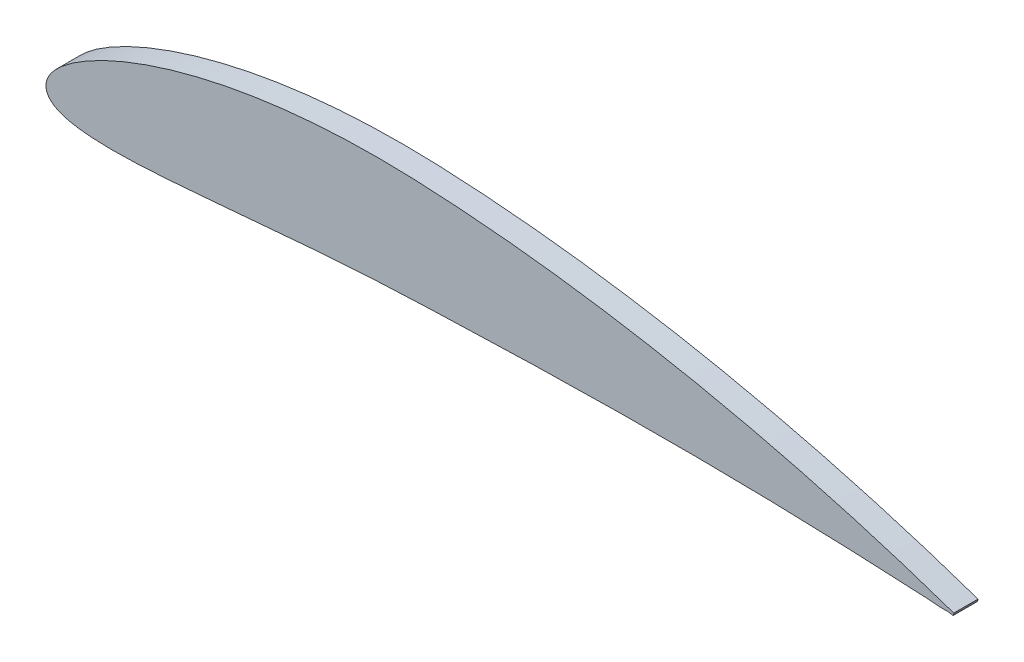
ISO-10303-21;
HEADER;
FILE_DESCRIPTION(('STEP AP214'),'2;1');
FILE_NAME('part.step','',(''),(''),'','','');
FILE_SCHEMA(('AUTOMOTIVE_DESIGN { 1 0 10303 214 1 1 1 1 }'));
ENDSEC;
DATA;
#1=APPLICATION_CONTEXT('core data for automotive mechanical design processes');
#2=APPLICATION_PROTOCOL_DEFINITION('international standard','automotive_design',2000,#1);
#3=PRODUCT_CONTEXT('',#1,'mechanical');
#4=PRODUCT('Part','Part','',(#3));
#5=PRODUCT_RELATED_PRODUCT_CATEGORY('part','',(#4));
#6=PRODUCT_DEFINITION_FORMATION('','',#4);
#7=PRODUCT_DEFINITION_CONTEXT('part definition',#1,'design');
#8=PRODUCT_DEFINITION('design','',#6,#7);
#9=PRODUCT_DEFINITION_SHAPE('','',#8);
#10=(LENGTH_UNIT() NAMED_UNIT(*) SI_UNIT(.MILLI.,.METRE.));
#11=(NAMED_UNIT(*) PLANE_ANGLE_UNIT() SI_UNIT($,.RADIAN.));
#12=(NAMED_UNIT(*) SI_UNIT($,.STERADIAN.) SOLID_ANGLE_UNIT());
#13=UNCERTAINTY_MEASURE_WITH_UNIT(LENGTH_MEASURE(1.E-05),#10,'distance_accuracy_value','');
#14=(GEOMETRIC_REPRESENTATION_CONTEXT(3) GLOBAL_UNCERTAINTY_ASSIGNED_CONTEXT((#13)) GLOBAL_UNIT_ASSIGNED_CONTEXT((#10,
#11,#12)) REPRESENTATION_CONTEXT('',''));
#15=CARTESIAN_POINT('',(0.,0.,0.));
#16=DIRECTION('',(0.,0.,1.));
#17=DIRECTION('',(1.,0.,0.));
#18=AXIS2_PLACEMENT_3D('',#15,#16,#17);
#19=CARTESIAN_POINT('',(161.929100397338,44.0446044657687,4.));
#20=CARTESIAN_POINT('',(161.795678545477,44.0905709277422,4.));
#21=CARTESIAN_POINT('',(161.264085559994,44.2737152059219,4.));
#22=CARTESIAN_POINT('',(160.074141782279,44.6843791570885,4.));
#23=CARTESIAN_POINT('',(158.100932585263,45.3469427722713,4.));
#24=CARTESIAN_POINT('',(155.365289101888,46.2489731269675,4.));
#25=CARTESIAN_POINT('',(151.890546460936,47.3534666851297,4.));
#26=CARTESIAN_POINT('',(147.709173725405,48.6259831787225,4.));
#27=CARTESIAN_POINT('',(142.862219870786,50.026640605332,4.));
#28=CARTESIAN_POINT('',(137.396269649,51.5113573455118,4.));
#29=CARTESIAN_POINT('',(131.366392873797,53.0353493280224,4.));
#30=CARTESIAN_POINT('',(124.833179772632,54.550430689247,4.));
#31=CARTESIAN_POINT('',(117.866527056055,56.0185707843522,4.));
#32=CARTESIAN_POINT('',(110.539162320194,57.3922281660989,4.));
#33=CARTESIAN_POINT('',(102.930106922823,58.630997492572,4.));
#34=CARTESIAN_POINT('',(95.1229065811543,59.7027110470993,4.));
#35=CARTESIAN_POINT('',(87.2052832633938,60.5729566099698,4.));
#36=CARTESIAN_POINT('',(79.262177626485,61.2141146853402,4.));
#37=CARTESIAN_POINT('',(71.3294619434141,61.6351664380537,4.));
#38=CARTESIAN_POINT('',(63.4919527344883,61.6847232377167,4.));
#39=CARTESIAN_POINT('',(55.8591825561266,61.3017861144408,4.));
#40=CARTESIAN_POINT('',(48.5895295329966,60.5246240796734,4.));
#41=CARTESIAN_POINT('',(41.7791614978956,59.3991089463527,4.));
#42=CARTESIAN_POINT('',(35.5177021533531,57.9743590926058,4.));
#43=CARTESIAN_POINT('',(29.8836338943388,56.3199344941267,4.));
#44=CARTESIAN_POINT('',(24.9428129391636,54.5099920343247,4.));
#45=CARTESIAN_POINT('',(20.7484042577943,52.6177610201734,4.));
#46=CARTESIAN_POINT('',(17.3401273050885,50.7161555624832,4.));
#47=CARTESIAN_POINT('',(14.7331117837232,48.8723746632682,4.));
#48=CARTESIAN_POINT('',(12.9413312663416,47.1265021049938,4.));
#49=CARTESIAN_POINT('',(11.9099397033239,45.4730517708416,4.));
#50=CARTESIAN_POINT('',(11.8164420630677,43.8089119153537,4.));
#51=CARTESIAN_POINT('',(12.8029145222721,42.475680068935,4.));
#52=CARTESIAN_POINT('',(14.5322731965218,41.6408256494263,4.));
#53=CARTESIAN_POINT('',(16.9099120470192,41.0927134361685,4.));
#54=CARTESIAN_POINT('',(19.9731320283488,40.8054231241279,4.));
#55=CARTESIAN_POINT('',(23.6914073729088,40.7479082465861,4.));
#56=CARTESIAN_POINT('',(28.029144691277,40.896002127822,4.));
#57=CARTESIAN_POINT('',(32.9375245198431,41.2131861222953,4.));
#58=CARTESIAN_POINT('',(38.3661406978582,41.6619384462275,4.));
#59=CARTESIAN_POINT('',(44.2622048766235,42.1909605862546,4.));
#60=CARTESIAN_POINT('',(50.5725853720705,42.755023335577,4.));
#61=CARTESIAN_POINT('',(57.2426134385432,43.3052191241959,4.));
#62=CARTESIAN_POINT('',(64.2169085440185,43.7904047952308,4.));
#63=CARTESIAN_POINT('',(71.4931667806558,44.1560160989153,4.));
#64=CARTESIAN_POINT('',(79.0066068702137,44.414261901271,4.));
#65=CARTESIAN_POINT('',(86.6785379066892,44.6804972247184,4.));
#66=CARTESIAN_POINT('',(94.3754840855875,44.8931754522267,4.));
#67=CARTESIAN_POINT('',(102.011569492043,45.0471842625793,4.));
#68=CARTESIAN_POINT('',(109.505352703518,45.1335615946811,4.));
#69=CARTESIAN_POINT('',(116.774307332402,45.1489722490971,4.));
#70=CARTESIAN_POINT('',(123.737407560928,45.0979173184749,4.));
#71=CARTESIAN_POINT('',(130.316160677973,44.992004461072,4.));
#72=CARTESIAN_POINT('',(136.434686880665,44.8344626433097,4.));
#73=CARTESIAN_POINT('',(142.021295535718,44.6527551572981,4.));
#74=CARTESIAN_POINT('',(147.012142722971,44.4498348393706,4.));
#75=CARTESIAN_POINT('',(151.337541470701,44.2565655854118,4.));
#76=CARTESIAN_POINT('',(154.9743264587,44.0515346790761,4.));
#77=CARTESIAN_POINT('',(157.795540148917,43.9522670296879,4.));
#78=CARTESIAN_POINT('',(159.96821903709,43.7000513376742,4.));
#79=CARTESIAN_POINT('',(161.044942863468,43.8565518824506,4.));
#80=CARTESIAN_POINT('',(161.873607648676,43.5516858555251,4.));
#81=CARTESIAN_POINT('',(161.887359437751,43.7860546973569,4.));
#82=CARTESIAN_POINT('',(161.891622907728,43.8587161172762,4.));
#83=B_SPLINE_CURVE_WITH_KNOTS('',3,(#19,#20,#21,#22,#23,#24,#25,#26,#27,#28,#29,#30,#31,#32,#33,
#34,#35,#36,#37,#38,#39,#40,#41,#42,#43,#44,#45,#46,#47,#48,#49,#50,#51,#52,#53,#54,#55,#56,#57,
#58,#59,#60,#61,#62,#63,#64,#65,#66,#67,#68,#69,#70,#71,#72,#73,#74,#75,#76,#77,#78,#79,#80,#81,
#82),.UNSPECIFIED.,.F.,.F.,(4,1,1,1,1,1,1,1,1,1,1,1,1,1,1,1,1,1,1,1,1,1,1,1,1,1,1,1,1,1,1,1,1,1,
1,1,1,1,1,1,1,1,1,1,1,1,1,1,1,1,1,1,1,1,1,1,1,1,1,1,1,4),(0.,0.00137157662502612,
0.00546477584250821,0.0122348018502247,0.0216019692657692,0.0334613445682541,0.0476712497544171,
0.0640813180473264,0.082496261138008,0.102719148689264,0.124527079157664,0.14767564836169,
0.171912572572513,0.196978379588112,0.222596912267761,0.248496766675201,0.274385100810321,
0.300041178316028,0.325689987882079,0.350525087532111,0.374279703233646,0.39671125377608,
0.41757673414408,0.436654005915542,0.45374438973928,0.468679993939526,0.481329415272233,
0.491630702034347,0.499615788540128,0.50554628117804,0.510184984462959,0.514824193684277,
0.520701508332397,0.528516039729706,0.538465751713385,0.55054260931231,0.564643256443601,
0.580638139182816,0.59834487637577,0.617584458372554,0.638174400803704,0.659922089978603,
0.682632113153432,0.706120665440723,0.730727382957721,0.755700243562022,0.780731768779878,
0.805564462972336,0.829932395841959,0.853570292180874,0.876213105152017,0.897609986535304,
0.917519393525195,0.935698347216139,0.951942678095032,0.966047158851578,0.977839939974046,
0.987174001699795,0.993931500880097,0.998018399437236,0.999385643972647,1.),.UNSPECIFIED.);
#84=DIRECTION('',(0.,0.,-1.));
#85=VECTOR('',#84,1.);
#86=SURFACE_OF_LINEAR_EXTRUSION('',#83,#85);
#87=CARTESIAN_POINT('',(161.929100397338,44.0446044657687,0.));
#88=CARTESIAN_POINT('',(161.795678545477,44.0905709277422,0.));
#89=CARTESIAN_POINT('',(161.264085559994,44.2737152059219,0.));
#90=CARTESIAN_POINT('',(160.074141782279,44.6843791570885,0.));
#91=CARTESIAN_POINT('',(158.100932585263,45.3469427722713,0.));
#92=CARTESIAN_POINT('',(155.365289101888,46.2489731269675,0.));
#93=CARTESIAN_POINT('',(151.890546460936,47.3534666851297,0.));
#94=CARTESIAN_POINT('',(147.709173725405,48.6259831787225,0.));
#95=CARTESIAN_POINT('',(142.862219870786,50.026640605332,0.));
#96=CARTESIAN_POINT('',(137.396269649,51.5113573455118,0.));
#97=CARTESIAN_POINT('',(131.366392873797,53.0353493280224,0.));
#98=CARTESIAN_POINT('',(124.833179772632,54.550430689247,0.));
#99=CARTESIAN_POINT('',(117.866527056055,56.0185707843522,0.));
#100=CARTESIAN_POINT('',(110.539162320194,57.3922281660989,0.));
#101=CARTESIAN_POINT('',(102.930106922823,58.630997492572,0.));
#102=CARTESIAN_POINT('',(95.1229065811543,59.7027110470993,0.));
#103=CARTESIAN_POINT('',(87.2052832633938,60.5729566099698,0.));
#104=CARTESIAN_POINT('',(79.262177626485,61.2141146853402,0.));
#105=CARTESIAN_POINT('',(71.3294619434141,61.6351664380537,0.));
#106=CARTESIAN_POINT('',(63.4919527344883,61.6847232377167,0.));
#107=CARTESIAN_POINT('',(55.8591825561266,61.3017861144408,0.));
#108=CARTESIAN_POINT('',(48.5895295329966,60.5246240796734,0.));
#109=CARTESIAN_POINT('',(41.7791614978956,59.3991089463527,0.));
#110=CARTESIAN_POINT('',(35.5177021533531,57.9743590926058,0.));
#111=CARTESIAN_POINT('',(29.8836338943388,56.3199344941267,0.));
#112=CARTESIAN_POINT('',(24.9428129391636,54.5099920343247,0.));
#113=CARTESIAN_POINT('',(20.7484042577943,52.6177610201734,0.));
#114=CARTESIAN_POINT('',(17.3401273050885,50.7161555624832,0.));
#115=CARTESIAN_POINT('',(14.7331117837232,48.8723746632682,0.));
#116=CARTESIAN_POINT('',(12.9413312663416,47.1265021049938,0.));
#117=CARTESIAN_POINT('',(11.9099397033239,45.4730517708416,0.));
#118=CARTESIAN_POINT('',(11.8164420630677,43.8089119153537,0.));
#119=CARTESIAN_POINT('',(12.8029145222721,42.475680068935,0.));
#120=CARTESIAN_POINT('',(14.5322731965218,41.6408256494263,0.));
#121=CARTESIAN_POINT('',(16.9099120470192,41.0927134361685,0.));
#122=CARTESIAN_POINT('',(19.9731320283488,40.8054231241279,0.));
#123=CARTESIAN_POINT('',(23.6914073729088,40.7479082465861,0.));
#124=CARTESIAN_POINT('',(28.029144691277,40.896002127822,0.));
#125=CARTESIAN_POINT('',(32.9375245198431,41.2131861222953,0.));
#126=CARTESIAN_POINT('',(38.3661406978582,41.6619384462275,0.));
#127=CARTESIAN_POINT('',(44.2622048766235,42.1909605862546,0.));
#128=CARTESIAN_POINT('',(50.5725853720705,42.755023335577,0.));
#129=CARTESIAN_POINT('',(57.2426134385432,43.3052191241959,0.));
#130=CARTESIAN_POINT('',(64.2169085440185,43.7904047952308,0.));
#131=CARTESIAN_POINT('',(71.4931667806558,44.1560160989153,0.));
#132=CARTESIAN_POINT('',(79.0066068702137,44.414261901271,0.));
#133=CARTESIAN_POINT('',(86.6785379066892,44.6804972247184,0.));
#134=CARTESIAN_POINT('',(94.3754840855875,44.8931754522267,0.));
#135=CARTESIAN_POINT('',(102.011569492043,45.0471842625793,0.));
#136=CARTESIAN_POINT('',(109.505352703518,45.1335615946811,0.));
#137=CARTESIAN_POINT('',(116.774307332402,45.1489722490971,0.));
#138=CARTESIAN_POINT('',(123.737407560928,45.0979173184749,0.));
#139=CARTESIAN_POINT('',(130.316160677973,44.992004461072,0.));
#140=CARTESIAN_POINT('',(136.434686880665,44.8344626433097,0.));
#141=CARTESIAN_POINT('',(142.021295535718,44.6527551572981,0.));
#142=CARTESIAN_POINT('',(147.012142722971,44.4498348393706,0.));
#143=CARTESIAN_POINT('',(151.337541470701,44.2565655854118,0.));
#144=CARTESIAN_POINT('',(154.9743264587,44.0515346790761,0.));
#145=CARTESIAN_POINT('',(157.795540148917,43.9522670296879,0.));
#146=CARTESIAN_POINT('',(159.96821903709,43.7000513376742,0.));
#147=CARTESIAN_POINT('',(161.044942863468,43.8565518824506,0.));
#148=CARTESIAN_POINT('',(161.873607648676,43.5516858555251,0.));
#149=CARTESIAN_POINT('',(161.887359437751,43.7860546973569,0.));
#150=CARTESIAN_POINT('',(161.891622907728,43.8587161172762,0.));
#151=B_SPLINE_CURVE_WITH_KNOTS('',3,(#87,#88,#89,#90,#91,#92,#93,#94,#95,#96,#97,#98,#99,#100,
#101,#102,#103,#104,#105,#106,#107,#108,#109,#110,#111,#112,#113,#114,#115,#116,#117,#118,#119,
#120,#121,#122,#123,#124,#125,#126,#127,#128,#129,#130,#131,#132,#133,#134,#135,#136,#137,#138,
#139,#140,#141,#142,#143,#144,#145,#146,#147,#148,#149,#150),.UNSPECIFIED.,.F.,.F.,(4,1,1,1,1,1,
1,1,1,1,1,1,1,1,1,1,1,1,1,1,1,1,1,1,1,1,1,1,1,1,1,1,1,1,1,1,1,1,1,1,1,1,1,1,1,1,1,1,1,1,1,1,1,1,
1,1,1,1,1,1,1,4),(0.,0.00137157662502612,0.00546477584250821,0.0122348018502247,
0.0216019692657692,0.0334613445682541,0.0476712497544171,0.0640813180473264,0.082496261138008,
0.102719148689264,0.124527079157664,0.14767564836169,0.171912572572513,0.196978379588112,
0.222596912267761,0.248496766675201,0.274385100810321,0.300041178316028,0.325689987882079,
0.350525087532111,0.374279703233646,0.39671125377608,0.41757673414408,0.436654005915542,
0.45374438973928,0.468679993939526,0.481329415272233,0.491630702034347,0.499615788540128,
0.50554628117804,0.510184984462959,0.514824193684277,0.520701508332397,0.528516039729706,
0.538465751713385,0.55054260931231,0.564643256443601,0.580638139182816,0.59834487637577,
0.617584458372554,0.638174400803704,0.659922089978603,0.682632113153432,0.706120665440723,
0.730727382957721,0.755700243562022,0.780731768779878,0.805564462972336,0.829932395841959,
0.853570292180874,0.876213105152017,0.897609986535304,0.917519393525195,0.935698347216139,
0.951942678095032,0.966047158851578,0.977839939974046,0.987174001699795,0.993931500880097,
0.998018399437236,0.999385643972647,1.),.UNSPECIFIED.);
#152=CARTESIAN_POINT('',(161.929100397338,44.0446044657687,0.));
#153=VERTEX_POINT('',#152);
#154=CARTESIAN_POINT('',(161.891622907728,43.8587161172762,0.));
#155=VERTEX_POINT('',#154);
#156=EDGE_CURVE('E73',#153,#155,#151,.T.);
#157=ORIENTED_EDGE('',*,*,#156,.T.);
#158=DIRECTION('',(0.,0.,-1.));
#159=VECTOR('',#158,1.);
#160=CARTESIAN_POINT('',(161.891622907728,43.8587161172762,4.));
#161=LINE('',#160,#159);
#162=CARTESIAN_POINT('',(161.891622907728,43.8587161172762,4.));
#163=VERTEX_POINT('',#162);
#164=EDGE_CURVE('E11',#163,#155,#161,.T.);
#165=ORIENTED_EDGE('',*,*,#164,.F.);
#166=CARTESIAN_POINT('',(161.929100397338,44.0446044657687,4.));
#167=VERTEX_POINT('',#166);
#168=EDGE_CURVE('E72',#167,#163,#83,.T.);
#169=ORIENTED_EDGE('',*,*,#168,.F.);
#170=DIRECTION('',(0.,0.,-1.));
#171=VECTOR('',#170,1.);
#172=CARTESIAN_POINT('',(161.929100397338,44.0446044657687,4.));
#173=LINE('',#172,#171);
#174=EDGE_CURVE('E50',#167,#153,#173,.T.);
#175=ORIENTED_EDGE('',*,*,#174,.T.);
#176=EDGE_LOOP('',(#157,#165,#169,#175));
#177=FACE_BOUND('',#176,.T.);
#178=ADVANCED_FACE('F41',(#177),#86,.F.);
#179=CARTESIAN_POINT('',(161.891622907728,43.8587161172762,4.));
#180=DIRECTION('',(-0.980275441528311,0.197636177701542,0.));
#181=DIRECTION('',(-0.197636177701542,-0.980275441528311,0.));
#182=AXIS2_PLACEMENT_3D('',#179,#180,#181);
#183=PLANE('',#182);
#184=DIRECTION('',(0.197636177701542,0.980275441528311,0.));
#185=VECTOR('',#184,1.);
#186=CARTESIAN_POINT('',(161.891622907728,43.8587161172762,0.));
#187=LINE('',#186,#185);
#188=EDGE_CURVE('E65',#155,#153,#187,.T.);
#189=ORIENTED_EDGE('',*,*,#188,.T.);
#190=ORIENTED_EDGE('',*,*,#174,.F.);
#191=DIRECTION('',(0.197636177701542,0.980275441528311,0.));
#192=VECTOR('',#191,1.);
#193=CARTESIAN_POINT('',(161.891622907728,43.8587161172762,4.));
#194=LINE('',#193,#192);
#195=EDGE_CURVE('E57',#163,#167,#194,.T.);
#196=ORIENTED_EDGE('',*,*,#195,.F.);
#197=ORIENTED_EDGE('',*,*,#164,.T.);
#198=EDGE_LOOP('',(#189,#190,#196,#197));
#199=FACE_BOUND('',#198,.T.);
#200=ADVANCED_FACE('F68',(#199),#183,.F.);
#201=CARTESIAN_POINT('',(12.8011348746342,46.8054858364978,4.));
#202=DIRECTION('',(0.,0.,1.));
#203=DIRECTION('',(1.,0.,0.));
#204=AXIS2_PLACEMENT_3D('',#201,#202,#203);
#205=PLANE('',#204);
#206=ORIENTED_EDGE('',*,*,#168,.T.);
#207=ORIENTED_EDGE('',*,*,#195,.T.);
#208=EDGE_LOOP('',(#206,#207));
#209=FACE_BOUND('',#208,.T.);
#210=ADVANCED_FACE('F90',(#209),#205,.T.);
#211=CARTESIAN_POINT('',(12.8011348746342,46.8054858364978,0.));
#212=DIRECTION('',(0.,0.,1.));
#213=DIRECTION('',(1.,0.,0.));
#214=AXIS2_PLACEMENT_3D('',#211,#212,#213);
#215=PLANE('',#214);
#216=ORIENTED_EDGE('',*,*,#156,.F.);
#217=ORIENTED_EDGE('',*,*,#188,.F.);
#218=EDGE_LOOP('',(#216,#217));
#219=FACE_BOUND('',#218,.T.);
#220=ADVANCED_FACE('F76',(#219),#215,.F.);
#221=CLOSED_SHELL('',(#178,#200,#210,#220));
#222=MANIFOLD_SOLID_BREP('B2',#221);
#223=ADVANCED_BREP_SHAPE_REPRESENTATION('',(#18,#222),#14);
#224=SHAPE_DEFINITION_REPRESENTATION(#9,#223);
ENDSEC;
END-ISO-10303-21;
